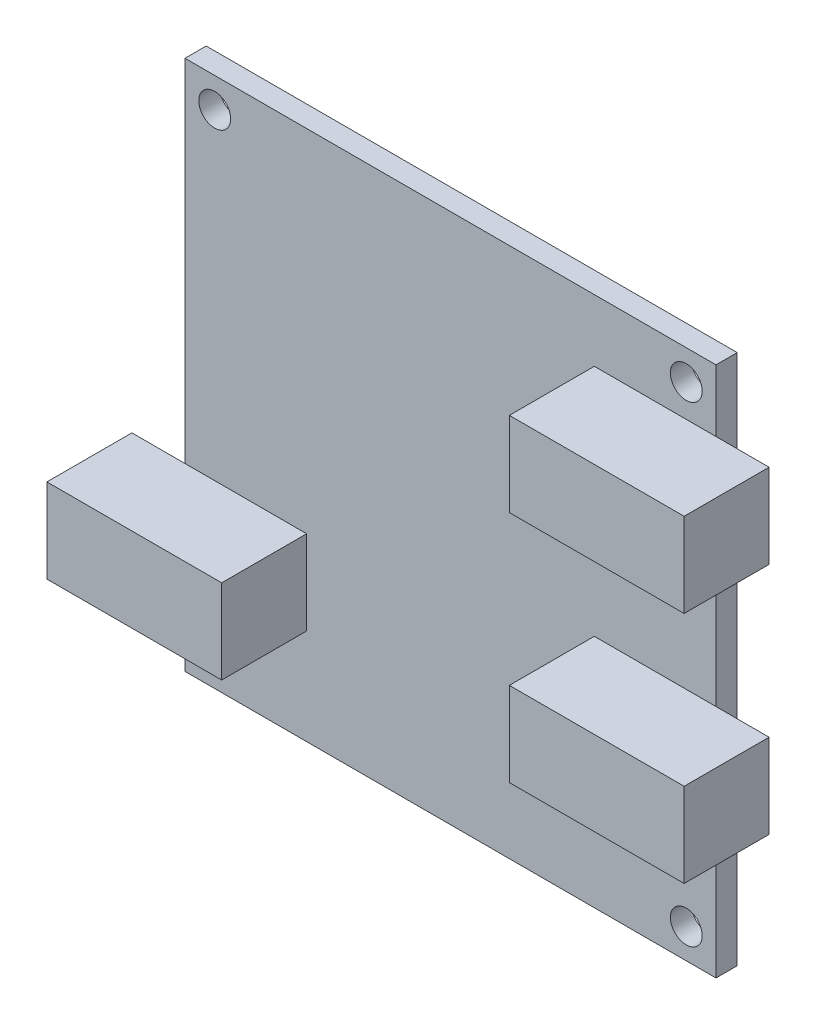
ISO-10303-21;
HEADER;
FILE_DESCRIPTION(('STEP AP214'),'2;1');
FILE_NAME('part.step','',(''),(''),'','','');
FILE_SCHEMA(('AUTOMOTIVE_DESIGN { 1 0 10303 214 1 1 1 1 }'));
ENDSEC;
DATA;
#1=APPLICATION_CONTEXT('core data for automotive mechanical design processes');
#2=APPLICATION_PROTOCOL_DEFINITION('international standard','automotive_design',2000,#1);
#3=PRODUCT_CONTEXT('',#1,'mechanical');
#4=PRODUCT('Part','Part','',(#3));
#5=PRODUCT_RELATED_PRODUCT_CATEGORY('part','',(#4));
#6=PRODUCT_DEFINITION_FORMATION('','',#4);
#7=PRODUCT_DEFINITION_CONTEXT('part definition',#1,'design');
#8=PRODUCT_DEFINITION('design','',#6,#7);
#9=PRODUCT_DEFINITION_SHAPE('','',#8);
#10=(LENGTH_UNIT() NAMED_UNIT(*) SI_UNIT(.MILLI.,.METRE.));
#11=(NAMED_UNIT(*) PLANE_ANGLE_UNIT() SI_UNIT($,.RADIAN.));
#12=(NAMED_UNIT(*) SI_UNIT($,.STERADIAN.) SOLID_ANGLE_UNIT());
#13=UNCERTAINTY_MEASURE_WITH_UNIT(LENGTH_MEASURE(1.E-05),#10,'distance_accuracy_value','');
#14=(GEOMETRIC_REPRESENTATION_CONTEXT(3) GLOBAL_UNCERTAINTY_ASSIGNED_CONTEXT((#13)) GLOBAL_UNIT_ASSIGNED_CONTEXT((#10,
#11,#12)) REPRESENTATION_CONTEXT('',''));
#15=CARTESIAN_POINT('',(0.,0.,0.));
#16=DIRECTION('',(0.,0.,1.));
#17=DIRECTION('',(1.,0.,0.));
#18=AXIS2_PLACEMENT_3D('',#15,#16,#17);
#19=CARTESIAN_POINT('',(13.5436408472055,-2.86503978913871,10.));
#20=DIRECTION('',(1.,0.,0.));
#21=DIRECTION('',(0.,1.,0.));
#22=AXIS2_PLACEMENT_3D('',#19,#20,#21);
#23=PLANE('',#22);
#24=DIRECTION('',(0.,-1.,0.));
#25=VECTOR('',#24,1.);
#26=CARTESIAN_POINT('',(13.5436408472055,-2.86503978913871,2.));
#27=LINE('',#26,#25);
#28=CARTESIAN_POINT('',(13.5436408472055,-2.86503978913871,2.));
#29=VERTEX_POINT('',#28);
#30=CARTESIAN_POINT('',(13.5436408472055,-10.7929581097691,2.));
#31=VERTEX_POINT('',#30);
#32=EDGE_CURVE('E12',#29,#31,#27,.T.);
#33=ORIENTED_EDGE('',*,*,#32,.T.);
#34=DIRECTION('',(0.,0.,-1.));
#35=VECTOR('',#34,1.);
#36=CARTESIAN_POINT('',(13.5436408472055,-10.7929581097691,10.));
#37=LINE('',#36,#35);
#38=CARTESIAN_POINT('',(13.5436408472055,-10.7929581097691,10.));
#39=VERTEX_POINT('',#38);
#40=EDGE_CURVE('E121',#39,#31,#37,.T.);
#41=ORIENTED_EDGE('',*,*,#40,.F.);
#42=DIRECTION('',(0.,-1.,0.));
#43=VECTOR('',#42,1.);
#44=CARTESIAN_POINT('',(13.5436408472055,-2.86503978913871,10.));
#45=LINE('',#44,#43);
#46=CARTESIAN_POINT('',(13.5436408472055,-2.86503978913871,10.));
#47=VERTEX_POINT('',#46);
#48=EDGE_CURVE('E54',#47,#39,#45,.T.);
#49=ORIENTED_EDGE('',*,*,#48,.F.);
#50=DIRECTION('',(0.,0.,-1.));
#51=VECTOR('',#50,1.);
#52=CARTESIAN_POINT('',(13.5436408472055,-2.86503978913871,10.));
#53=LINE('',#52,#51);
#54=EDGE_CURVE('E109',#47,#29,#53,.T.);
#55=ORIENTED_EDGE('',*,*,#54,.T.);
#56=EDGE_LOOP('',(#33,#41,#49,#55));
#57=FACE_BOUND('',#56,.T.);
#58=ADVANCED_FACE('F50',(#57),#23,.F.);
#59=CARTESIAN_POINT('',(13.5436408472055,-10.7929581097691,10.));
#60=DIRECTION('',(0.,1.,0.));
#61=DIRECTION('',(0.,0.,1.));
#62=AXIS2_PLACEMENT_3D('',#59,#60,#61);
#63=PLANE('',#62);
#64=DIRECTION('',(1.,0.,0.));
#65=VECTOR('',#64,1.);
#66=CARTESIAN_POINT('',(13.5436408472055,-10.7929581097691,2.));
#67=LINE('',#66,#65);
#68=CARTESIAN_POINT('',(30.,-10.7929581097691,2.));
#69=VERTEX_POINT('',#68);
#70=EDGE_CURVE('E60',#31,#69,#67,.T.);
#71=ORIENTED_EDGE('',*,*,#70,.T.);
#72=DIRECTION('',(0.,0.,-1.));
#73=VECTOR('',#72,1.);
#74=CARTESIAN_POINT('',(30.,-10.7929581097691,10.));
#75=LINE('',#74,#73);
#76=CARTESIAN_POINT('',(30.,-10.7929581097691,10.));
#77=VERTEX_POINT('',#76);
#78=EDGE_CURVE('E105',#77,#69,#75,.T.);
#79=ORIENTED_EDGE('',*,*,#78,.F.);
#80=DIRECTION('',(1.,0.,0.));
#81=VECTOR('',#80,1.);
#82=CARTESIAN_POINT('',(13.5436408472055,-10.7929581097691,10.));
#83=LINE('',#82,#81);
#84=EDGE_CURVE('E84',#39,#77,#83,.T.);
#85=ORIENTED_EDGE('',*,*,#84,.F.);
#86=ORIENTED_EDGE('',*,*,#40,.T.);
#87=EDGE_LOOP('',(#71,#79,#85,#86));
#88=FACE_BOUND('',#87,.T.);
#89=ADVANCED_FACE('F124',(#88),#63,.F.);
#90=CARTESIAN_POINT('',(30.,-2.86503978913871,10.));
#91=DIRECTION('',(-1.,0.,0.));
#92=DIRECTION('',(0.,0.,1.));
#93=AXIS2_PLACEMENT_3D('',#90,#91,#92);
#94=PLANE('',#93);
#95=DIRECTION('',(0.,1.,0.));
#96=VECTOR('',#95,1.);
#97=CARTESIAN_POINT('',(30.,-2.86503978913871,2.));
#98=LINE('',#97,#96);
#99=CARTESIAN_POINT('',(30.,-2.86503978913871,2.));
#100=VERTEX_POINT('',#99);
#101=EDGE_CURVE('E100',#69,#100,#98,.T.);
#102=ORIENTED_EDGE('',*,*,#101,.T.);
#103=DIRECTION('',(0.,0.,-1.));
#104=VECTOR('',#103,1.);
#105=CARTESIAN_POINT('',(30.,-2.86503978913871,10.));
#106=LINE('',#105,#104);
#107=CARTESIAN_POINT('',(30.,-2.86503978913871,10.));
#108=VERTEX_POINT('',#107);
#109=EDGE_CURVE('E103',#108,#100,#106,.T.);
#110=ORIENTED_EDGE('',*,*,#109,.F.);
#111=DIRECTION('',(0.,1.,0.));
#112=VECTOR('',#111,1.);
#113=CARTESIAN_POINT('',(30.,-2.86503978913871,10.));
#114=LINE('',#113,#112);
#115=EDGE_CURVE('E117',#77,#108,#114,.T.);
#116=ORIENTED_EDGE('',*,*,#115,.F.);
#117=ORIENTED_EDGE('',*,*,#78,.T.);
#118=EDGE_LOOP('',(#102,#110,#116,#117));
#119=FACE_BOUND('',#118,.T.);
#120=ADVANCED_FACE('F101',(#119),#94,.F.);
#121=CARTESIAN_POINT('',(13.5436408472055,-2.86503978913871,10.));
#122=DIRECTION('',(0.,-1.,0.));
#123=DIRECTION('',(0.,0.,-1.));
#124=AXIS2_PLACEMENT_3D('',#121,#122,#123);
#125=PLANE('',#124);
#126=DIRECTION('',(-1.,0.,0.));
#127=VECTOR('',#126,1.);
#128=CARTESIAN_POINT('',(13.5436408472055,-2.86503978913871,2.));
#129=LINE('',#128,#127);
#130=EDGE_CURVE('E94',#100,#29,#129,.T.);
#131=ORIENTED_EDGE('',*,*,#130,.T.);
#132=ORIENTED_EDGE('',*,*,#54,.F.);
#133=DIRECTION('',(-1.,0.,0.));
#134=VECTOR('',#133,1.);
#135=CARTESIAN_POINT('',(13.5436408472055,-2.86503978913871,10.));
#136=LINE('',#135,#134);
#137=EDGE_CURVE('E108',#108,#47,#136,.T.);
#138=ORIENTED_EDGE('',*,*,#137,.F.);
#139=ORIENTED_EDGE('',*,*,#109,.T.);
#140=EDGE_LOOP('',(#131,#132,#138,#139));
#141=FACE_BOUND('',#140,.T.);
#142=ADVANCED_FACE('F107',(#141),#125,.F.);
#143=CARTESIAN_POINT('',(0.,0.,10.));
#144=DIRECTION('',(0.,0.,1.));
#145=DIRECTION('',(1.,0.,0.));
#146=AXIS2_PLACEMENT_3D('',#143,#144,#145);
#147=PLANE('',#146);
#148=ORIENTED_EDGE('',*,*,#48,.T.);
#149=ORIENTED_EDGE('',*,*,#84,.T.);
#150=ORIENTED_EDGE('',*,*,#115,.T.);
#151=ORIENTED_EDGE('',*,*,#137,.T.);
#152=EDGE_LOOP('',(#148,#149,#150,#151));
#153=FACE_BOUND('',#152,.T.);
#154=ADVANCED_FACE('F52',(#153),#147,.T.);
#155=CARTESIAN_POINT('',(0.,0.,2.));
#156=DIRECTION('',(0.,0.,1.));
#157=DIRECTION('',(1.,0.,0.));
#158=AXIS2_PLACEMENT_3D('',#155,#156,#157);
#159=PLANE('',#158);
#160=ORIENTED_EDGE('',*,*,#32,.F.);
#161=ORIENTED_EDGE('',*,*,#130,.F.);
#162=ORIENTED_EDGE('',*,*,#101,.F.);
#163=ORIENTED_EDGE('',*,*,#70,.F.);
#164=EDGE_LOOP('',(#160,#161,#162,#163));
#165=FACE_BOUND('',#164,.T.);
#166=ADVANCED_FACE('F111',(#165),#159,.F.);
#167=CLOSED_SHELL('',(#58,#89,#120,#142,#154,#166));
#168=MANIFOLD_SOLID_BREP('B2',#167);
#169=CARTESIAN_POINT('',(13.5436408472055,19.1525947547903,10.));
#170=DIRECTION('',(1.,0.,0.));
#171=DIRECTION('',(0.,1.,0.));
#172=AXIS2_PLACEMENT_3D('',#169,#170,#171);
#173=PLANE('',#172);
#174=DIRECTION('',(0.,-1.,0.));
#175=VECTOR('',#174,1.);
#176=CARTESIAN_POINT('',(13.5436408472055,19.1525947547903,2.));
#177=LINE('',#176,#175);
#178=CARTESIAN_POINT('',(13.5436408472055,19.1525947547903,2.));
#179=VERTEX_POINT('',#178);
#180=CARTESIAN_POINT('',(13.5436408472055,11.2246764341599,2.));
#181=VERTEX_POINT('',#180);
#182=EDGE_CURVE('E48',#179,#181,#177,.T.);
#183=ORIENTED_EDGE('',*,*,#182,.T.);
#184=DIRECTION('',(0.,0.,-1.));
#185=VECTOR('',#184,1.);
#186=CARTESIAN_POINT('',(13.5436408472055,11.2246764341599,10.));
#187=LINE('',#186,#185);
#188=CARTESIAN_POINT('',(13.5436408472055,11.2246764341599,10.));
#189=VERTEX_POINT('',#188);
#190=EDGE_CURVE('E255',#189,#181,#187,.T.);
#191=ORIENTED_EDGE('',*,*,#190,.F.);
#192=DIRECTION('',(0.,-1.,0.));
#193=VECTOR('',#192,1.);
#194=CARTESIAN_POINT('',(13.5436408472055,19.1525947547903,10.));
#195=LINE('',#194,#193);
#196=CARTESIAN_POINT('',(13.5436408472055,19.1525947547903,10.));
#197=VERTEX_POINT('',#196);
#198=EDGE_CURVE('E188',#197,#189,#195,.T.);
#199=ORIENTED_EDGE('',*,*,#198,.F.);
#200=DIRECTION('',(0.,0.,-1.));
#201=VECTOR('',#200,1.);
#202=CARTESIAN_POINT('',(13.5436408472055,19.1525947547903,10.));
#203=LINE('',#202,#201);
#204=EDGE_CURVE('E243',#197,#179,#203,.T.);
#205=ORIENTED_EDGE('',*,*,#204,.T.);
#206=EDGE_LOOP('',(#183,#191,#199,#205));
#207=FACE_BOUND('',#206,.T.);
#208=ADVANCED_FACE('F184',(#207),#173,.F.);
#209=CARTESIAN_POINT('',(13.5436408472055,11.2246764341599,10.));
#210=DIRECTION('',(0.,1.,0.));
#211=DIRECTION('',(-1.,0.,0.));
#212=AXIS2_PLACEMENT_3D('',#209,#210,#211);
#213=PLANE('',#212);
#214=DIRECTION('',(1.,0.,0.));
#215=VECTOR('',#214,1.);
#216=CARTESIAN_POINT('',(13.5436408472055,11.2246764341599,2.));
#217=LINE('',#216,#215);
#218=CARTESIAN_POINT('',(30.,11.2246764341599,2.));
#219=VERTEX_POINT('',#218);
#220=EDGE_CURVE('E194',#181,#219,#217,.T.);
#221=ORIENTED_EDGE('',*,*,#220,.T.);
#222=DIRECTION('',(0.,0.,-1.));
#223=VECTOR('',#222,1.);
#224=CARTESIAN_POINT('',(30.,11.2246764341599,10.));
#225=LINE('',#224,#223);
#226=CARTESIAN_POINT('',(30.,11.2246764341599,10.));
#227=VERTEX_POINT('',#226);
#228=EDGE_CURVE('E239',#227,#219,#225,.T.);
#229=ORIENTED_EDGE('',*,*,#228,.F.);
#230=DIRECTION('',(1.,0.,0.));
#231=VECTOR('',#230,1.);
#232=CARTESIAN_POINT('',(13.5436408472055,11.2246764341599,10.));
#233=LINE('',#232,#231);
#234=EDGE_CURVE('E218',#189,#227,#233,.T.);
#235=ORIENTED_EDGE('',*,*,#234,.F.);
#236=ORIENTED_EDGE('',*,*,#190,.T.);
#237=EDGE_LOOP('',(#221,#229,#235,#236));
#238=FACE_BOUND('',#237,.T.);
#239=ADVANCED_FACE('F258',(#238),#213,.F.);
#240=CARTESIAN_POINT('',(30.,19.1525947547903,10.));
#241=DIRECTION('',(-1.,0.,0.));
#242=DIRECTION('',(0.,-1.,0.));
#243=AXIS2_PLACEMENT_3D('',#240,#241,#242);
#244=PLANE('',#243);
#245=DIRECTION('',(0.,1.,0.));
#246=VECTOR('',#245,1.);
#247=CARTESIAN_POINT('',(30.,19.1525947547903,2.));
#248=LINE('',#247,#246);
#249=CARTESIAN_POINT('',(30.,19.1525947547903,2.));
#250=VERTEX_POINT('',#249);
#251=EDGE_CURVE('E234',#219,#250,#248,.T.);
#252=ORIENTED_EDGE('',*,*,#251,.T.);
#253=DIRECTION('',(0.,0.,-1.));
#254=VECTOR('',#253,1.);
#255=CARTESIAN_POINT('',(30.,19.1525947547903,10.));
#256=LINE('',#255,#254);
#257=CARTESIAN_POINT('',(30.,19.1525947547903,10.));
#258=VERTEX_POINT('',#257);
#259=EDGE_CURVE('E237',#258,#250,#256,.T.);
#260=ORIENTED_EDGE('',*,*,#259,.F.);
#261=DIRECTION('',(0.,1.,0.));
#262=VECTOR('',#261,1.);
#263=CARTESIAN_POINT('',(30.,19.1525947547903,10.));
#264=LINE('',#263,#262);
#265=EDGE_CURVE('E251',#227,#258,#264,.T.);
#266=ORIENTED_EDGE('',*,*,#265,.F.);
#267=ORIENTED_EDGE('',*,*,#228,.T.);
#268=EDGE_LOOP('',(#252,#260,#266,#267));
#269=FACE_BOUND('',#268,.T.);
#270=ADVANCED_FACE('F235',(#269),#244,.F.);
#271=CARTESIAN_POINT('',(13.5436408472055,19.1525947547903,10.));
#272=DIRECTION('',(0.,-1.,0.));
#273=DIRECTION('',(1.,0.,0.));
#274=AXIS2_PLACEMENT_3D('',#271,#272,#273);
#275=PLANE('',#274);
#276=DIRECTION('',(-1.,0.,0.));
#277=VECTOR('',#276,1.);
#278=CARTESIAN_POINT('',(13.5436408472055,19.1525947547903,2.));
#279=LINE('',#278,#277);
#280=EDGE_CURVE('E228',#250,#179,#279,.T.);
#281=ORIENTED_EDGE('',*,*,#280,.T.);
#282=ORIENTED_EDGE('',*,*,#204,.F.);
#283=DIRECTION('',(-1.,0.,0.));
#284=VECTOR('',#283,1.);
#285=CARTESIAN_POINT('',(13.5436408472055,19.1525947547903,10.));
#286=LINE('',#285,#284);
#287=EDGE_CURVE('E242',#258,#197,#286,.T.);
#288=ORIENTED_EDGE('',*,*,#287,.F.);
#289=ORIENTED_EDGE('',*,*,#259,.T.);
#290=EDGE_LOOP('',(#281,#282,#288,#289));
#291=FACE_BOUND('',#290,.T.);
#292=ADVANCED_FACE('F241',(#291),#275,.F.);
#293=CARTESIAN_POINT('',(0.,0.,10.));
#294=DIRECTION('',(0.,0.,1.));
#295=DIRECTION('',(1.,0.,0.));
#296=AXIS2_PLACEMENT_3D('',#293,#294,#295);
#297=PLANE('',#296);
#298=ORIENTED_EDGE('',*,*,#198,.T.);
#299=ORIENTED_EDGE('',*,*,#234,.T.);
#300=ORIENTED_EDGE('',*,*,#265,.T.);
#301=ORIENTED_EDGE('',*,*,#287,.T.);
#302=EDGE_LOOP('',(#298,#299,#300,#301));
#303=FACE_BOUND('',#302,.T.);
#304=ADVANCED_FACE('F186',(#303),#297,.T.);
#305=CARTESIAN_POINT('',(0.,0.,2.));
#306=DIRECTION('',(0.,0.,1.));
#307=DIRECTION('',(1.,0.,0.));
#308=AXIS2_PLACEMENT_3D('',#305,#306,#307);
#309=PLANE('',#308);
#310=ORIENTED_EDGE('',*,*,#182,.F.);
#311=ORIENTED_EDGE('',*,*,#280,.F.);
#312=ORIENTED_EDGE('',*,*,#251,.F.);
#313=ORIENTED_EDGE('',*,*,#220,.F.);
#314=EDGE_LOOP('',(#310,#311,#312,#313));
#315=FACE_BOUND('',#314,.T.);
#316=ADVANCED_FACE('F245',(#315),#309,.F.);
#317=CLOSED_SHELL('',(#208,#239,#270,#292,#304,#316));
#318=MANIFOLD_SOLID_BREP('B6',#317);
#319=CARTESIAN_POINT('',(-30.,-8.0456596818279,10.));
#320=DIRECTION('',(1.,0.,0.));
#321=DIRECTION('',(0.,0.,-1.));
#322=AXIS2_PLACEMENT_3D('',#319,#320,#321);
#323=PLANE('',#322);
#324=DIRECTION('',(0.,-1.,0.));
#325=VECTOR('',#324,1.);
#326=CARTESIAN_POINT('',(-30.,-8.0456596818279,2.));
#327=LINE('',#326,#325);
#328=CARTESIAN_POINT('',(-30.,-8.0456596818279,2.));
#329=VERTEX_POINT('',#328);
#330=CARTESIAN_POINT('',(-30.,-15.9735780024583,2.));
#331=VERTEX_POINT('',#330);
#332=EDGE_CURVE('E380',#329,#331,#327,.T.);
#333=ORIENTED_EDGE('',*,*,#332,.T.);
#334=DIRECTION('',(0.,0.,-1.));
#335=VECTOR('',#334,1.);
#336=CARTESIAN_POINT('',(-30.,-15.9735780024583,10.));
#337=LINE('',#336,#335);
#338=CARTESIAN_POINT('',(-30.,-15.9735780024583,10.));
#339=VERTEX_POINT('',#338);
#340=EDGE_CURVE('E182',#339,#331,#337,.T.);
#341=ORIENTED_EDGE('',*,*,#340,.F.);
#342=DIRECTION('',(0.,-1.,0.));
#343=VECTOR('',#342,1.);
#344=CARTESIAN_POINT('',(-30.,-8.0456596818279,10.));
#345=LINE('',#344,#343);
#346=CARTESIAN_POINT('',(-30.,-8.0456596818279,10.));
#347=VERTEX_POINT('',#346);
#348=EDGE_CURVE('E368',#347,#339,#345,.T.);
#349=ORIENTED_EDGE('',*,*,#348,.F.);
#350=DIRECTION('',(0.,0.,-1.));
#351=VECTOR('',#350,1.);
#352=CARTESIAN_POINT('',(-30.,-8.0456596818279,10.));
#353=LINE('',#352,#351);
#354=EDGE_CURVE('E376',#347,#329,#353,.T.);
#355=ORIENTED_EDGE('',*,*,#354,.T.);
#356=EDGE_LOOP('',(#333,#341,#349,#355));
#357=FACE_BOUND('',#356,.T.);
#358=ADVANCED_FACE('F317',(#357),#323,.F.);
#359=CARTESIAN_POINT('',(-30.,-15.9735780024583,10.));
#360=DIRECTION('',(0.,1.,0.));
#361=DIRECTION('',(0.,0.,1.));
#362=AXIS2_PLACEMENT_3D('',#359,#360,#361);
#363=PLANE('',#362);
#364=DIRECTION('',(1.,0.,0.));
#365=VECTOR('',#364,1.);
#366=CARTESIAN_POINT('',(-30.,-15.9735780024583,2.));
#367=LINE('',#366,#365);
#368=CARTESIAN_POINT('',(-13.5436408472055,-15.9735780024583,2.));
#369=VERTEX_POINT('',#368);
#370=EDGE_CURVE('E372',#331,#369,#367,.T.);
#371=ORIENTED_EDGE('',*,*,#370,.T.);
#372=DIRECTION('',(0.,0.,-1.));
#373=VECTOR('',#372,1.);
#374=CARTESIAN_POINT('',(-13.5436408472055,-15.9735780024583,10.));
#375=LINE('',#374,#373);
#376=CARTESIAN_POINT('',(-13.5436408472055,-15.9735780024583,10.));
#377=VERTEX_POINT('',#376);
#378=EDGE_CURVE('E325',#377,#369,#375,.T.);
#379=ORIENTED_EDGE('',*,*,#378,.F.);
#380=DIRECTION('',(1.,0.,0.));
#381=VECTOR('',#380,1.);
#382=CARTESIAN_POINT('',(-30.,-15.9735780024583,10.));
#383=LINE('',#382,#381);
#384=EDGE_CURVE('E363',#339,#377,#383,.T.);
#385=ORIENTED_EDGE('',*,*,#384,.F.);
#386=ORIENTED_EDGE('',*,*,#340,.T.);
#387=EDGE_LOOP('',(#371,#379,#385,#386));
#388=FACE_BOUND('',#387,.T.);
#389=ADVANCED_FACE('F371',(#388),#363,.F.);
#390=CARTESIAN_POINT('',(-13.5436408472055,-8.0456596818279,10.));
#391=DIRECTION('',(-1.,0.,0.));
#392=DIRECTION('',(0.,0.,1.));
#393=AXIS2_PLACEMENT_3D('',#390,#391,#392);
#394=PLANE('',#393);
#395=DIRECTION('',(0.,1.,0.));
#396=VECTOR('',#395,1.);
#397=CARTESIAN_POINT('',(-13.5436408472055,-8.0456596818279,2.));
#398=LINE('',#397,#396);
#399=CARTESIAN_POINT('',(-13.5436408472055,-8.0456596818279,2.));
#400=VERTEX_POINT('',#399);
#401=EDGE_CURVE('E350',#369,#400,#398,.T.);
#402=ORIENTED_EDGE('',*,*,#401,.T.);
#403=DIRECTION('',(0.,0.,-1.));
#404=VECTOR('',#403,1.);
#405=CARTESIAN_POINT('',(-13.5436408472055,-8.0456596818279,10.));
#406=LINE('',#405,#404);
#407=CARTESIAN_POINT('',(-13.5436408472055,-8.0456596818279,10.));
#408=VERTEX_POINT('',#407);
#409=EDGE_CURVE('E373',#408,#400,#406,.T.);
#410=ORIENTED_EDGE('',*,*,#409,.F.);
#411=DIRECTION('',(0.,1.,0.));
#412=VECTOR('',#411,1.);
#413=CARTESIAN_POINT('',(-13.5436408472055,-8.0456596818279,10.));
#414=LINE('',#413,#412);
#415=EDGE_CURVE('E366',#377,#408,#414,.T.);
#416=ORIENTED_EDGE('',*,*,#415,.F.);
#417=ORIENTED_EDGE('',*,*,#378,.T.);
#418=EDGE_LOOP('',(#402,#410,#416,#417));
#419=FACE_BOUND('',#418,.T.);
#420=ADVANCED_FACE('F374',(#419),#394,.F.);
#421=CARTESIAN_POINT('',(-30.,-8.0456596818279,10.));
#422=DIRECTION('',(0.,-1.,0.));
#423=DIRECTION('',(0.,0.,-1.));
#424=AXIS2_PLACEMENT_3D('',#421,#422,#423);
#425=PLANE('',#424);
#426=DIRECTION('',(-1.,0.,0.));
#427=VECTOR('',#426,1.);
#428=CARTESIAN_POINT('',(-30.,-8.0456596818279,2.));
#429=LINE('',#428,#427);
#430=EDGE_CURVE('E356',#400,#329,#429,.T.);
#431=ORIENTED_EDGE('',*,*,#430,.T.);
#432=ORIENTED_EDGE('',*,*,#354,.F.);
#433=DIRECTION('',(-1.,0.,0.));
#434=VECTOR('',#433,1.);
#435=CARTESIAN_POINT('',(-30.,-8.0456596818279,10.));
#436=LINE('',#435,#434);
#437=EDGE_CURVE('E333',#408,#347,#436,.T.);
#438=ORIENTED_EDGE('',*,*,#437,.F.);
#439=ORIENTED_EDGE('',*,*,#409,.T.);
#440=EDGE_LOOP('',(#431,#432,#438,#439));
#441=FACE_BOUND('',#440,.T.);
#442=ADVANCED_FACE('F387',(#441),#425,.F.);
#443=CARTESIAN_POINT('',(0.,0.,10.));
#444=DIRECTION('',(0.,0.,1.));
#445=DIRECTION('',(1.,0.,0.));
#446=AXIS2_PLACEMENT_3D('',#443,#444,#445);
#447=PLANE('',#446);
#448=ORIENTED_EDGE('',*,*,#348,.T.);
#449=ORIENTED_EDGE('',*,*,#384,.T.);
#450=ORIENTED_EDGE('',*,*,#415,.T.);
#451=ORIENTED_EDGE('',*,*,#437,.T.);
#452=EDGE_LOOP('',(#448,#449,#450,#451));
#453=FACE_BOUND('',#452,.T.);
#454=ADVANCED_FACE('F364',(#453),#447,.T.);
#455=CARTESIAN_POINT('',(0.,0.,2.));
#456=DIRECTION('',(0.,0.,1.));
#457=DIRECTION('',(1.,0.,0.));
#458=AXIS2_PLACEMENT_3D('',#455,#456,#457);
#459=PLANE('',#458);
#460=ORIENTED_EDGE('',*,*,#332,.F.);
#461=ORIENTED_EDGE('',*,*,#430,.F.);
#462=ORIENTED_EDGE('',*,*,#401,.F.);
#463=ORIENTED_EDGE('',*,*,#370,.F.);
#464=EDGE_LOOP('',(#460,#461,#462,#463));
#465=FACE_BOUND('',#464,.T.);
#466=ADVANCED_FACE('F390',(#465),#459,.F.);
#467=CLOSED_SHELL('',(#358,#389,#420,#442,#454,#466));
#468=MANIFOLD_SOLID_BREP('B42',#467);
#469=CARTESIAN_POINT('',(25.,25.,2.));
#470=DIRECTION('',(0.,-1.,0.));
#471=DIRECTION('',(0.,0.,-1.));
#472=AXIS2_PLACEMENT_3D('',#469,#470,#471);
#473=PLANE('',#472);
#474=DIRECTION('',(-1.,0.,0.));
#475=VECTOR('',#474,1.);
#476=CARTESIAN_POINT('',(25.,25.,0.));
#477=LINE('',#476,#475);
#478=CARTESIAN_POINT('',(25.,25.,0.));
#479=VERTEX_POINT('',#478);
#480=CARTESIAN_POINT('',(-25.,25.,0.));
#481=VERTEX_POINT('',#480);
#482=EDGE_CURVE('E504',#479,#481,#477,.T.);
#483=ORIENTED_EDGE('',*,*,#482,.T.);
#484=DIRECTION('',(0.,0.,-1.));
#485=VECTOR('',#484,1.);
#486=CARTESIAN_POINT('',(-25.,25.,2.));
#487=LINE('',#486,#485);
#488=CARTESIAN_POINT('',(-25.,25.,2.));
#489=VERTEX_POINT('',#488);
#490=EDGE_CURVE('E315',#489,#481,#487,.T.);
#491=ORIENTED_EDGE('',*,*,#490,.F.);
#492=DIRECTION('',(-1.,0.,0.));
#493=VECTOR('',#492,1.);
#494=CARTESIAN_POINT('',(25.,25.,2.));
#495=LINE('',#494,#493);
#496=CARTESIAN_POINT('',(25.,25.,2.));
#497=VERTEX_POINT('',#496);
#498=EDGE_CURVE('E492',#497,#489,#495,.T.);
#499=ORIENTED_EDGE('',*,*,#498,.F.);
#500=DIRECTION('',(0.,0.,-1.));
#501=VECTOR('',#500,1.);
#502=CARTESIAN_POINT('',(25.,25.,2.));
#503=LINE('',#502,#501);
#504=EDGE_CURVE('E500',#497,#479,#503,.T.);
#505=ORIENTED_EDGE('',*,*,#504,.T.);
#506=EDGE_LOOP('',(#483,#491,#499,#505));
#507=FACE_BOUND('',#506,.T.);
#508=ADVANCED_FACE('F441',(#507),#473,.F.);
#509=CARTESIAN_POINT('',(-25.,-25.,2.));
#510=DIRECTION('',(1.,0.,0.));
#511=DIRECTION('',(0.,0.,-1.));
#512=AXIS2_PLACEMENT_3D('',#509,#510,#511);
#513=PLANE('',#512);
#514=DIRECTION('',(0.,-1.,0.));
#515=VECTOR('',#514,1.);
#516=CARTESIAN_POINT('',(-25.,-25.,0.));
#517=LINE('',#516,#515);
#518=CARTESIAN_POINT('',(-25.,-25.,0.));
#519=VERTEX_POINT('',#518);
#520=EDGE_CURVE('E496',#481,#519,#517,.T.);
#521=ORIENTED_EDGE('',*,*,#520,.T.);
#522=DIRECTION('',(0.,0.,-1.));
#523=VECTOR('',#522,1.);
#524=CARTESIAN_POINT('',(-25.,-25.,2.));
#525=LINE('',#524,#523);
#526=CARTESIAN_POINT('',(-25.,-25.,2.));
#527=VERTEX_POINT('',#526);
#528=EDGE_CURVE('E449',#527,#519,#525,.T.);
#529=ORIENTED_EDGE('',*,*,#528,.F.);
#530=DIRECTION('',(0.,-1.,0.));
#531=VECTOR('',#530,1.);
#532=CARTESIAN_POINT('',(-25.,-25.,2.));
#533=LINE('',#532,#531);
#534=EDGE_CURVE('E487',#489,#527,#533,.T.);
#535=ORIENTED_EDGE('',*,*,#534,.F.);
#536=ORIENTED_EDGE('',*,*,#490,.T.);
#537=EDGE_LOOP('',(#521,#529,#535,#536));
#538=FACE_BOUND('',#537,.T.);
#539=ADVANCED_FACE('F495',(#538),#513,.F.);
#540=CARTESIAN_POINT('',(25.,-25.,2.));
#541=DIRECTION('',(0.,1.,0.));
#542=DIRECTION('',(0.,0.,1.));
#543=AXIS2_PLACEMENT_3D('',#540,#541,#542);
#544=PLANE('',#543);
#545=DIRECTION('',(1.,0.,0.));
#546=VECTOR('',#545,1.);
#547=CARTESIAN_POINT('',(25.,-25.,0.));
#548=LINE('',#547,#546);
#549=CARTESIAN_POINT('',(25.,-25.,0.));
#550=VERTEX_POINT('',#549);
#551=EDGE_CURVE('E474',#519,#550,#548,.T.);
#552=ORIENTED_EDGE('',*,*,#551,.T.);
#553=DIRECTION('',(0.,0.,-1.));
#554=VECTOR('',#553,1.);
#555=CARTESIAN_POINT('',(25.,-25.,2.));
#556=LINE('',#555,#554);
#557=CARTESIAN_POINT('',(25.,-25.,2.));
#558=VERTEX_POINT('',#557);
#559=EDGE_CURVE('E497',#558,#550,#556,.T.);
#560=ORIENTED_EDGE('',*,*,#559,.F.);
#561=DIRECTION('',(1.,0.,0.));
#562=VECTOR('',#561,1.);
#563=CARTESIAN_POINT('',(25.,-25.,2.));
#564=LINE('',#563,#562);
#565=EDGE_CURVE('E490',#527,#558,#564,.T.);
#566=ORIENTED_EDGE('',*,*,#565,.F.);
#567=ORIENTED_EDGE('',*,*,#528,.T.);
#568=EDGE_LOOP('',(#552,#560,#566,#567));
#569=FACE_BOUND('',#568,.T.);
#570=ADVANCED_FACE('F498',(#569),#544,.F.);
#571=CARTESIAN_POINT('',(25.,-25.,2.));
#572=DIRECTION('',(-1.,0.,0.));
#573=DIRECTION('',(0.,0.,1.));
#574=AXIS2_PLACEMENT_3D('',#571,#572,#573);
#575=PLANE('',#574);
#576=DIRECTION('',(0.,1.,0.));
#577=VECTOR('',#576,1.);
#578=CARTESIAN_POINT('',(25.,-25.,0.));
#579=LINE('',#578,#577);
#580=EDGE_CURVE('E480',#550,#479,#579,.T.);
#581=ORIENTED_EDGE('',*,*,#580,.T.);
#582=ORIENTED_EDGE('',*,*,#504,.F.);
#583=DIRECTION('',(0.,1.,0.));
#584=VECTOR('',#583,1.);
#585=CARTESIAN_POINT('',(25.,-25.,2.));
#586=LINE('',#585,#584);
#587=EDGE_CURVE('E457',#558,#497,#586,.T.);
#588=ORIENTED_EDGE('',*,*,#587,.F.);
#589=ORIENTED_EDGE('',*,*,#559,.T.);
#590=EDGE_LOOP('',(#581,#582,#588,#589));
#591=FACE_BOUND('',#590,.T.);
#592=ADVANCED_FACE('F512',(#591),#575,.F.);
#593=CARTESIAN_POINT('',(0.,0.,2.));
#594=DIRECTION('',(0.,0.,-1.));
#595=DIRECTION('',(-1.,0.,0.));
#596=AXIS2_PLACEMENT_3D('',#593,#594,#595);
#597=PLANE('',#596);
#598=CARTESIAN_POINT('',(-22.2,22.2,2.));
#599=DIRECTION('',(0.,0.,1.));
#600=DIRECTION('',(1.,0.,0.));
#601=AXIS2_PLACEMENT_3D('',#598,#599,#600);
#602=CIRCLE('',#601,1.5);
#603=CARTESIAN_POINT('',(-20.7,22.2,2.));
#604=VERTEX_POINT('',#603);
#605=EDGE_CURVE('E527',#604,#604,#602,.T.);
#606=ORIENTED_EDGE('',*,*,#605,.F.);
#607=EDGE_LOOP('',(#606));
#608=FACE_BOUND('',#607,.T.);
#609=CARTESIAN_POINT('',(-22.2,-22.2,2.));
#610=DIRECTION('',(0.,0.,1.));
#611=DIRECTION('',(1.,0.,0.));
#612=AXIS2_PLACEMENT_3D('',#609,#610,#611);
#613=CIRCLE('',#612,1.5);
#614=CARTESIAN_POINT('',(-20.7,-22.2,2.));
#615=VERTEX_POINT('',#614);
#616=EDGE_CURVE('E533',#615,#615,#613,.T.);
#617=ORIENTED_EDGE('',*,*,#616,.F.);
#618=EDGE_LOOP('',(#617));
#619=FACE_BOUND('',#618,.T.);
#620=CARTESIAN_POINT('',(22.2,-22.2,2.));
#621=DIRECTION('',(0.,0.,1.));
#622=DIRECTION('',(1.,0.,0.));
#623=AXIS2_PLACEMENT_3D('',#620,#621,#622);
#624=CIRCLE('',#623,1.5);
#625=CARTESIAN_POINT('',(23.7,-22.2,2.));
#626=VERTEX_POINT('',#625);
#627=EDGE_CURVE('E521',#626,#626,#624,.T.);
#628=ORIENTED_EDGE('',*,*,#627,.F.);
#629=EDGE_LOOP('',(#628));
#630=FACE_BOUND('',#629,.T.);
#631=CARTESIAN_POINT('',(22.2,22.2,2.));
#632=DIRECTION('',(0.,0.,1.));
#633=DIRECTION('',(1.,0.,0.));
#634=AXIS2_PLACEMENT_3D('',#631,#632,#633);
#635=CIRCLE('',#634,1.5);
#636=CARTESIAN_POINT('',(23.7,22.2,2.));
#637=VERTEX_POINT('',#636);
#638=EDGE_CURVE('E518',#637,#637,#635,.T.);
#639=ORIENTED_EDGE('',*,*,#638,.F.);
#640=EDGE_LOOP('',(#639));
#641=FACE_BOUND('',#640,.T.);
#642=ORIENTED_EDGE('',*,*,#498,.T.);
#643=ORIENTED_EDGE('',*,*,#534,.T.);
#644=ORIENTED_EDGE('',*,*,#565,.T.);
#645=ORIENTED_EDGE('',*,*,#587,.T.);
#646=EDGE_LOOP('',(#642,#643,#644,#645));
#647=FACE_BOUND('',#646,.T.);
#648=ADVANCED_FACE('F488',(#608,#619,#630,#641,#647),#597,.F.);
#649=CARTESIAN_POINT('',(0.,0.,0.));
#650=DIRECTION('',(0.,0.,-1.));
#651=DIRECTION('',(-1.,0.,0.));
#652=AXIS2_PLACEMENT_3D('',#649,#650,#651);
#653=PLANE('',#652);
#654=CARTESIAN_POINT('',(-22.2,22.2,0.));
#655=DIRECTION('',(0.,0.,1.));
#656=DIRECTION('',(1.,0.,0.));
#657=AXIS2_PLACEMENT_3D('',#654,#655,#656);
#658=CIRCLE('',#657,1.5);
#659=CARTESIAN_POINT('',(-20.7,22.2,0.));
#660=VERTEX_POINT('',#659);
#661=EDGE_CURVE('E524',#660,#660,#658,.T.);
#662=ORIENTED_EDGE('',*,*,#661,.T.);
#663=EDGE_LOOP('',(#662));
#664=FACE_BOUND('',#663,.T.);
#665=CARTESIAN_POINT('',(-22.2,-22.2,0.));
#666=DIRECTION('',(0.,0.,1.));
#667=DIRECTION('',(1.,0.,0.));
#668=AXIS2_PLACEMENT_3D('',#665,#666,#667);
#669=CIRCLE('',#668,1.5);
#670=CARTESIAN_POINT('',(-20.7,-22.2,0.));
#671=VERTEX_POINT('',#670);
#672=EDGE_CURVE('E530',#671,#671,#669,.T.);
#673=ORIENTED_EDGE('',*,*,#672,.T.);
#674=EDGE_LOOP('',(#673));
#675=FACE_BOUND('',#674,.T.);
#676=CARTESIAN_POINT('',(22.2,-22.2,0.));
#677=DIRECTION('',(0.,0.,1.));
#678=DIRECTION('',(1.,0.,0.));
#679=AXIS2_PLACEMENT_3D('',#676,#677,#678);
#680=CIRCLE('',#679,1.5);
#681=CARTESIAN_POINT('',(23.7,-22.2,0.));
#682=VERTEX_POINT('',#681);
#683=EDGE_CURVE('E536',#682,#682,#680,.T.);
#684=ORIENTED_EDGE('',*,*,#683,.T.);
#685=EDGE_LOOP('',(#684));
#686=FACE_BOUND('',#685,.T.);
#687=CARTESIAN_POINT('',(22.2,22.2,0.));
#688=DIRECTION('',(0.,0.,1.));
#689=DIRECTION('',(1.,0.,0.));
#690=AXIS2_PLACEMENT_3D('',#687,#688,#689);
#691=CIRCLE('',#690,1.5);
#692=CARTESIAN_POINT('',(23.7,22.2,0.));
#693=VERTEX_POINT('',#692);
#694=EDGE_CURVE('E507',#693,#693,#691,.T.);
#695=ORIENTED_EDGE('',*,*,#694,.T.);
#696=EDGE_LOOP('',(#695));
#697=FACE_BOUND('',#696,.T.);
#698=ORIENTED_EDGE('',*,*,#482,.F.);
#699=ORIENTED_EDGE('',*,*,#580,.F.);
#700=ORIENTED_EDGE('',*,*,#551,.F.);
#701=ORIENTED_EDGE('',*,*,#520,.F.);
#702=EDGE_LOOP('',(#698,#699,#700,#701));
#703=FACE_BOUND('',#702,.T.);
#704=ADVANCED_FACE('F515',(#664,#675,#686,#697,#703),#653,.T.);
#705=CARTESIAN_POINT('',(22.2,22.2,0.));
#706=DIRECTION('',(0.,0.,1.));
#707=DIRECTION('',(1.,0.,0.));
#708=AXIS2_PLACEMENT_3D('',#705,#706,#707);
#709=CYLINDRICAL_SURFACE('',#708,1.5);
#710=ORIENTED_EDGE('',*,*,#694,.F.);
#711=EDGE_LOOP('',(#710));
#712=FACE_BOUND('',#711,.T.);
#713=ORIENTED_EDGE('',*,*,#638,.T.);
#714=EDGE_LOOP('',(#713));
#715=FACE_BOUND('',#714,.T.);
#716=ADVANCED_FACE('F550',(#712,#715),#709,.F.);
#717=CARTESIAN_POINT('',(22.2,-22.2,0.));
#718=DIRECTION('',(0.,0.,1.));
#719=DIRECTION('',(1.,0.,0.));
#720=AXIS2_PLACEMENT_3D('',#717,#718,#719);
#721=CYLINDRICAL_SURFACE('',#720,1.5);
#722=ORIENTED_EDGE('',*,*,#683,.F.);
#723=EDGE_LOOP('',(#722));
#724=FACE_BOUND('',#723,.T.);
#725=ORIENTED_EDGE('',*,*,#627,.T.);
#726=EDGE_LOOP('',(#725));
#727=FACE_BOUND('',#726,.T.);
#728=ADVANCED_FACE('F542',(#724,#727),#721,.F.);
#729=CARTESIAN_POINT('',(-22.2,-22.2,0.));
#730=DIRECTION('',(0.,0.,1.));
#731=DIRECTION('',(1.,0.,0.));
#732=AXIS2_PLACEMENT_3D('',#729,#730,#731);
#733=CYLINDRICAL_SURFACE('',#732,1.5);
#734=ORIENTED_EDGE('',*,*,#672,.F.);
#735=EDGE_LOOP('',(#734));
#736=FACE_BOUND('',#735,.T.);
#737=ORIENTED_EDGE('',*,*,#616,.T.);
#738=EDGE_LOOP('',(#737));
#739=FACE_BOUND('',#738,.T.);
#740=ADVANCED_FACE('F558',(#736,#739),#733,.F.);
#741=CARTESIAN_POINT('',(-22.2,22.2,0.));
#742=DIRECTION('',(0.,0.,1.));
#743=DIRECTION('',(1.,0.,0.));
#744=AXIS2_PLACEMENT_3D('',#741,#742,#743);
#745=CYLINDRICAL_SURFACE('',#744,1.5);
#746=ORIENTED_EDGE('',*,*,#661,.F.);
#747=EDGE_LOOP('',(#746));
#748=FACE_BOUND('',#747,.T.);
#749=ORIENTED_EDGE('',*,*,#605,.T.);
#750=EDGE_LOOP('',(#749));
#751=FACE_BOUND('',#750,.T.);
#752=ADVANCED_FACE('F609',(#748,#751),#745,.F.);
#753=CLOSED_SHELL('',(#508,#539,#570,#592,#648,#704,#716,#728,#740,#752));
#754=MANIFOLD_SOLID_BREP('B176',#753);
#755=ADVANCED_BREP_SHAPE_REPRESENTATION('',(#18,#168,#318,#468,#754),#14);
#756=SHAPE_DEFINITION_REPRESENTATION(#9,#755);
ENDSEC;
END-ISO-10303-21;
